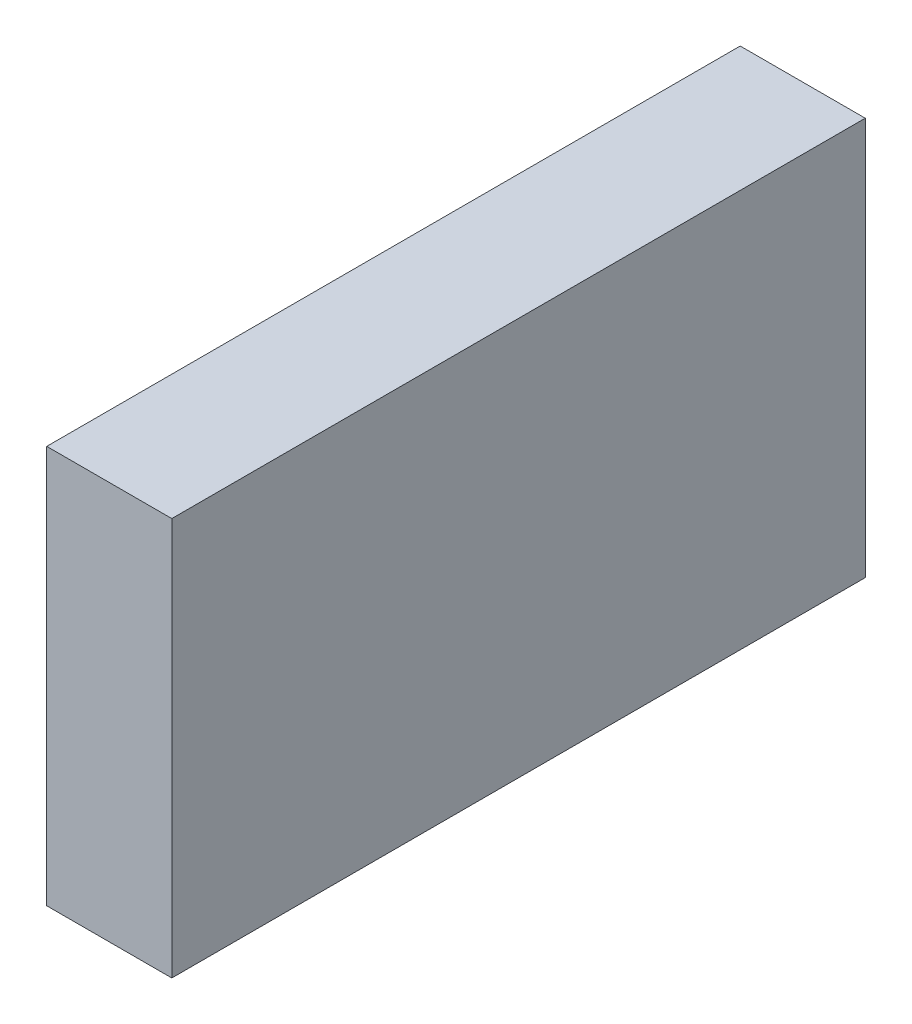
ISO-10303-21;
HEADER;
FILE_DESCRIPTION(('STEP AP214'),'2;1');
FILE_NAME('part.step','',(''),(''),'','','');
FILE_SCHEMA(('AUTOMOTIVE_DESIGN { 1 0 10303 214 1 1 1 1 }'));
ENDSEC;
DATA;
#1=APPLICATION_CONTEXT('core data for automotive mechanical design processes');
#2=APPLICATION_PROTOCOL_DEFINITION('international standard','automotive_design',2000,#1);
#3=PRODUCT_CONTEXT('',#1,'mechanical');
#4=PRODUCT('Part','Part','',(#3));
#5=PRODUCT_RELATED_PRODUCT_CATEGORY('part','',(#4));
#6=PRODUCT_DEFINITION_FORMATION('','',#4);
#7=PRODUCT_DEFINITION_CONTEXT('part definition',#1,'design');
#8=PRODUCT_DEFINITION('design','',#6,#7);
#9=PRODUCT_DEFINITION_SHAPE('','',#8);
#10=(LENGTH_UNIT() NAMED_UNIT(*) SI_UNIT(.MILLI.,.METRE.));
#11=(NAMED_UNIT(*) PLANE_ANGLE_UNIT() SI_UNIT($,.RADIAN.));
#12=(NAMED_UNIT(*) SI_UNIT($,.STERADIAN.) SOLID_ANGLE_UNIT());
#13=UNCERTAINTY_MEASURE_WITH_UNIT(LENGTH_MEASURE(1.E-05),#10,'distance_accuracy_value','');
#14=(GEOMETRIC_REPRESENTATION_CONTEXT(3) GLOBAL_UNCERTAINTY_ASSIGNED_CONTEXT((#13)) GLOBAL_UNIT_ASSIGNED_CONTEXT((#10,
#11,#12)) REPRESENTATION_CONTEXT('',''));
#15=CARTESIAN_POINT('',(0.,0.,0.));
#16=DIRECTION('',(0.,0.,1.));
#17=DIRECTION('',(1.,0.,0.));
#18=AXIS2_PLACEMENT_3D('',#15,#16,#17);
#19=CARTESIAN_POINT('',(0.,70.,0.));
#20=DIRECTION('',(0.,0.,1.));
#21=DIRECTION('',(1.,0.,0.));
#22=AXIS2_PLACEMENT_3D('',#19,#20,#21);
#23=PLANE('',#22);
#24=DIRECTION('',(0.,1.,0.));
#25=VECTOR('',#24,1.);
#26=CARTESIAN_POINT('',(0.,0.,0.));
#27=LINE('',#26,#25);
#28=CARTESIAN_POINT('',(0.,0.,0.));
#29=VERTEX_POINT('',#28);
#30=CARTESIAN_POINT('',(0.,70.,0.));
#31=VERTEX_POINT('',#30);
#32=EDGE_CURVE('E39',#29,#31,#27,.T.);
#33=ORIENTED_EDGE('',*,*,#32,.F.);
#34=DIRECTION('',(1.,0.,0.));
#35=VECTOR('',#34,1.);
#36=CARTESIAN_POINT('',(0.,0.,0.));
#37=LINE('',#36,#35);
#38=CARTESIAN_POINT('',(22.,0.,0.));
#39=VERTEX_POINT('',#38);
#40=EDGE_CURVE('E11',#29,#39,#37,.T.);
#41=ORIENTED_EDGE('',*,*,#40,.T.);
#42=DIRECTION('',(0.,-1.,0.));
#43=VECTOR('',#42,1.);
#44=CARTESIAN_POINT('',(22.,0.,0.));
#45=LINE('',#44,#43);
#46=CARTESIAN_POINT('',(22.,70.,0.));
#47=VERTEX_POINT('',#46);
#48=EDGE_CURVE('E90',#47,#39,#45,.T.);
#49=ORIENTED_EDGE('',*,*,#48,.F.);
#50=DIRECTION('',(1.,0.,0.));
#51=VECTOR('',#50,1.);
#52=CARTESIAN_POINT('',(0.,70.,0.));
#53=LINE('',#52,#51);
#54=EDGE_CURVE('E27',#31,#47,#53,.T.);
#55=ORIENTED_EDGE('',*,*,#54,.F.);
#56=EDGE_LOOP('',(#33,#41,#49,#55));
#57=FACE_BOUND('',#56,.T.);
#58=ADVANCED_FACE('F16',(#57),#23,.T.);
#59=CARTESIAN_POINT('',(0.,70.,-122.));
#60=DIRECTION('',(0.,1.,0.));
#61=DIRECTION('',(1.,0.,0.));
#62=AXIS2_PLACEMENT_3D('',#59,#60,#61);
#63=PLANE('',#62);
#64=DIRECTION('',(0.,0.,-1.));
#65=VECTOR('',#64,1.);
#66=CARTESIAN_POINT('',(0.,70.,0.));
#67=LINE('',#66,#65);
#68=CARTESIAN_POINT('',(0.,70.,-122.));
#69=VERTEX_POINT('',#68);
#70=EDGE_CURVE('E101',#31,#69,#67,.T.);
#71=ORIENTED_EDGE('',*,*,#70,.F.);
#72=ORIENTED_EDGE('',*,*,#54,.T.);
#73=DIRECTION('',(0.,0.,1.));
#74=VECTOR('',#73,1.);
#75=CARTESIAN_POINT('',(22.,70.,0.));
#76=LINE('',#75,#74);
#77=CARTESIAN_POINT('',(22.,70.,-122.));
#78=VERTEX_POINT('',#77);
#79=EDGE_CURVE('E80',#78,#47,#76,.T.);
#80=ORIENTED_EDGE('',*,*,#79,.F.);
#81=DIRECTION('',(1.,0.,0.));
#82=VECTOR('',#81,1.);
#83=CARTESIAN_POINT('',(0.,70.,-122.));
#84=LINE('',#83,#82);
#85=EDGE_CURVE('E74',#69,#78,#84,.T.);
#86=ORIENTED_EDGE('',*,*,#85,.F.);
#87=EDGE_LOOP('',(#71,#72,#80,#86));
#88=FACE_BOUND('',#87,.T.);
#89=ADVANCED_FACE('F129',(#88),#63,.T.);
#90=CARTESIAN_POINT('',(0.,0.,-122.));
#91=DIRECTION('',(0.,0.,-1.));
#92=DIRECTION('',(0.,-1.,0.));
#93=AXIS2_PLACEMENT_3D('',#90,#91,#92);
#94=PLANE('',#93);
#95=DIRECTION('',(0.,-1.,0.));
#96=VECTOR('',#95,1.);
#97=CARTESIAN_POINT('',(0.,70.,-122.));
#98=LINE('',#97,#96);
#99=CARTESIAN_POINT('',(0.,0.,-122.));
#100=VERTEX_POINT('',#99);
#101=EDGE_CURVE('E20',#69,#100,#98,.T.);
#102=ORIENTED_EDGE('',*,*,#101,.F.);
#103=ORIENTED_EDGE('',*,*,#85,.T.);
#104=DIRECTION('',(0.,1.,0.));
#105=VECTOR('',#104,1.);
#106=CARTESIAN_POINT('',(22.,70.,-122.));
#107=LINE('',#106,#105);
#108=CARTESIAN_POINT('',(22.,0.,-122.));
#109=VERTEX_POINT('',#108);
#110=EDGE_CURVE('E68',#109,#78,#107,.T.);
#111=ORIENTED_EDGE('',*,*,#110,.F.);
#112=DIRECTION('',(1.,0.,0.));
#113=VECTOR('',#112,1.);
#114=CARTESIAN_POINT('',(0.,0.,-122.));
#115=LINE('',#114,#113);
#116=EDGE_CURVE('E71',#100,#109,#115,.T.);
#117=ORIENTED_EDGE('',*,*,#116,.F.);
#118=EDGE_LOOP('',(#102,#103,#111,#117));
#119=FACE_BOUND('',#118,.T.);
#120=ADVANCED_FACE('F70',(#119),#94,.T.);
#121=CARTESIAN_POINT('',(0.,0.,0.));
#122=DIRECTION('',(0.,-1.,0.));
#123=DIRECTION('',(0.,0.,-1.));
#124=AXIS2_PLACEMENT_3D('',#121,#122,#123);
#125=PLANE('',#124);
#126=DIRECTION('',(0.,0.,1.));
#127=VECTOR('',#126,1.);
#128=CARTESIAN_POINT('',(0.,0.,-122.));
#129=LINE('',#128,#127);
#130=EDGE_CURVE('E85',#100,#29,#129,.T.);
#131=ORIENTED_EDGE('',*,*,#130,.F.);
#132=ORIENTED_EDGE('',*,*,#116,.T.);
#133=DIRECTION('',(0.,0.,-1.));
#134=VECTOR('',#133,1.);
#135=CARTESIAN_POINT('',(22.,0.,-122.));
#136=LINE('',#135,#134);
#137=EDGE_CURVE('E79',#39,#109,#136,.T.);
#138=ORIENTED_EDGE('',*,*,#137,.F.);
#139=ORIENTED_EDGE('',*,*,#40,.F.);
#140=EDGE_LOOP('',(#131,#132,#138,#139));
#141=FACE_BOUND('',#140,.T.);
#142=ADVANCED_FACE('F84',(#141),#125,.T.);
#143=CARTESIAN_POINT('',(22.,35.,-61.));
#144=DIRECTION('',(1.,0.,0.));
#145=DIRECTION('',(0.,1.,0.));
#146=AXIS2_PLACEMENT_3D('',#143,#144,#145);
#147=PLANE('',#146);
#148=ORIENTED_EDGE('',*,*,#137,.T.);
#149=ORIENTED_EDGE('',*,*,#110,.T.);
#150=ORIENTED_EDGE('',*,*,#79,.T.);
#151=ORIENTED_EDGE('',*,*,#48,.T.);
#152=EDGE_LOOP('',(#148,#149,#150,#151));
#153=FACE_BOUND('',#152,.T.);
#154=ADVANCED_FACE('F88',(#153),#147,.T.);
#155=CARTESIAN_POINT('',(0.,35.,-61.));
#156=DIRECTION('',(1.,0.,0.));
#157=DIRECTION('',(0.,1.,0.));
#158=AXIS2_PLACEMENT_3D('',#155,#156,#157);
#159=PLANE('',#158);
#160=ORIENTED_EDGE('',*,*,#130,.T.);
#161=ORIENTED_EDGE('',*,*,#32,.T.);
#162=ORIENTED_EDGE('',*,*,#70,.T.);
#163=ORIENTED_EDGE('',*,*,#101,.T.);
#164=EDGE_LOOP('',(#160,#161,#162,#163));
#165=FACE_BOUND('',#164,.T.);
#166=ADVANCED_FACE('F18',(#165),#159,.F.);
#167=CLOSED_SHELL('',(#58,#89,#120,#142,#154,#166));
#168=MANIFOLD_SOLID_BREP('B1',#167);
#169=ADVANCED_BREP_SHAPE_REPRESENTATION('',(#18,#168),#14);
#170=SHAPE_DEFINITION_REPRESENTATION(#9,#169);
ENDSEC;
END-ISO-10303-21;
